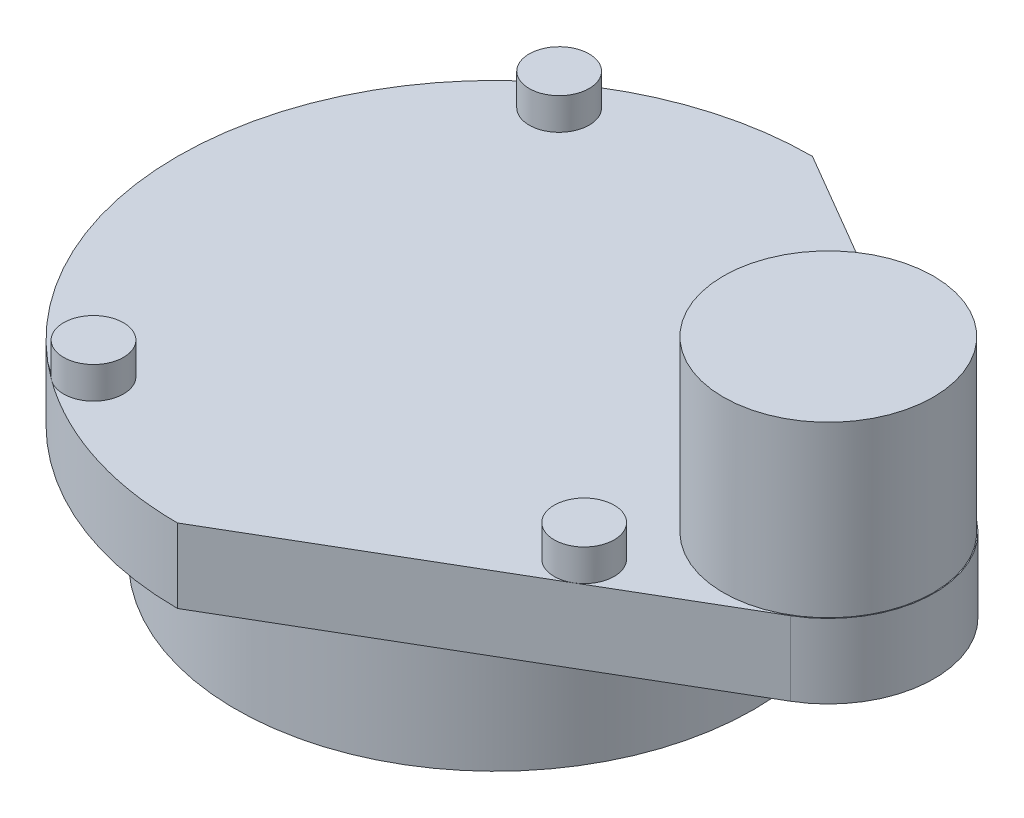
ISO-10303-21;
HEADER;
FILE_DESCRIPTION(('STEP AP214'),'2;1');
FILE_NAME('part.step','',(''),(''),'','','');
FILE_SCHEMA(('AUTOMOTIVE_DESIGN { 1 0 10303 214 1 1 1 1 }'));
ENDSEC;
DATA;
#1=APPLICATION_CONTEXT('core data for automotive mechanical design processes');
#2=APPLICATION_PROTOCOL_DEFINITION('international standard','automotive_design',2000,#1);
#3=PRODUCT_CONTEXT('',#1,'mechanical');
#4=PRODUCT('Part','Part','',(#3));
#5=PRODUCT_RELATED_PRODUCT_CATEGORY('part','',(#4));
#6=PRODUCT_DEFINITION_FORMATION('','',#4);
#7=PRODUCT_DEFINITION_CONTEXT('part definition',#1,'design');
#8=PRODUCT_DEFINITION('design','',#6,#7);
#9=PRODUCT_DEFINITION_SHAPE('','',#8);
#10=(LENGTH_UNIT() NAMED_UNIT(*) SI_UNIT(.MILLI.,.METRE.));
#11=(NAMED_UNIT(*) PLANE_ANGLE_UNIT() SI_UNIT($,.RADIAN.));
#12=(NAMED_UNIT(*) SI_UNIT($,.STERADIAN.) SOLID_ANGLE_UNIT());
#13=UNCERTAINTY_MEASURE_WITH_UNIT(LENGTH_MEASURE(1.E-05),#10,'distance_accuracy_value','');
#14=(GEOMETRIC_REPRESENTATION_CONTEXT(3) GLOBAL_UNCERTAINTY_ASSIGNED_CONTEXT((#13)) GLOBAL_UNIT_ASSIGNED_CONTEXT((#10,
#11,#12)) REPRESENTATION_CONTEXT('',''));
#15=CARTESIAN_POINT('',(0.,0.,0.));
#16=DIRECTION('',(0.,0.,1.));
#17=DIRECTION('',(1.,0.,0.));
#18=AXIS2_PLACEMENT_3D('',#15,#16,#17);
#19=CARTESIAN_POINT('',(0.,-4.7625,0.));
#20=DIRECTION('',(0.,-1.,0.));
#21=DIRECTION('',(1.,0.,0.));
#22=AXIS2_PLACEMENT_3D('',#19,#20,#21);
#23=PLANE('',#22);
#24=CARTESIAN_POINT('',(0.,-4.7625,0.));
#25=DIRECTION('',(0.,-1.,0.));
#26=DIRECTION('',(1.,0.,0.));
#27=AXIS2_PLACEMENT_3D('',#24,#25,#26);
#28=CIRCLE('',#27,47.625);
#29=CARTESIAN_POINT('',(-27.9382539410221,-4.76250000002943,-38.5693478260847));
#30=VERTEX_POINT('',#29);
#31=CARTESIAN_POINT('',(-1.70466679303106E-10,-4.7625,-47.625));
#32=VERTEX_POINT('',#31);
#33=EDGE_CURVE('E82',#30,#32,#28,.T.);
#34=ORIENTED_EDGE('',*,*,#33,.F.);
#35=CARTESIAN_POINT('',(-25.2984189229742,-4.76250000002665,-34.925));
#36=DIRECTION('',(0.,-1.,0.));
#37=DIRECTION('',(1.,0.,0.));
#38=AXIS2_PLACEMENT_3D('',#35,#36,#37);
#39=CIRCLE('',#38,4.5);
#40=EDGE_CURVE('E104',#30,#30,#39,.T.);
#41=ORIENTED_EDGE('',*,*,#40,.T.);
#42=CARTESIAN_POINT('',(-27.9382539410221,-4.76250000002943,38.5693478260847));
#43=VERTEX_POINT('',#42);
#44=EDGE_CURVE('E93',#43,#30,#28,.T.);
#45=ORIENTED_EDGE('',*,*,#44,.F.);
#46=CARTESIAN_POINT('',(-25.2984189229742,-4.76250000002665,34.925));
#47=DIRECTION('',(0.,-1.,0.));
#48=DIRECTION('',(1.,0.,0.));
#49=AXIS2_PLACEMENT_3D('',#46,#47,#48);
#50=CIRCLE('',#49,4.5);
#51=EDGE_CURVE('E219',#43,#43,#50,.T.);
#52=ORIENTED_EDGE('',*,*,#51,.T.);
#53=CARTESIAN_POINT('',(-5.67658206880522E-11,-4.7625,47.6250000000533));
#54=VERTEX_POINT('',#53);
#55=EDGE_CURVE('E97',#54,#43,#28,.T.);
#56=ORIENTED_EDGE('',*,*,#55,.F.);
#57=DIRECTION('',(0.86328533345341,0.,-0.504716190590549));
#58=VECTOR('',#57,1.);
#59=CARTESIAN_POINT('',(171089.791720872,-4.76250000119319,-99979.3123057166));
#60=LINE('',#59,#58);
#61=CARTESIAN_POINT('',(37.4792549511165,-4.76250000002666,25.7129090005403));
#62=VERTEX_POINT('',#61);
#63=EDGE_CURVE('E113',#54,#62,#60,.T.);
#64=ORIENTED_EDGE('',*,*,#63,.T.);
#65=CARTESIAN_POINT('',(35.2080320934591,-4.76250000002665,21.828125));
#66=DIRECTION('',(0.,-1.,0.));
#67=DIRECTION('',(1.,0.,0.));
#68=AXIS2_PLACEMENT_3D('',#65,#66,#67);
#69=CIRCLE('',#68,4.5);
#70=EDGE_CURVE('E224',#62,#62,#69,.T.);
#71=ORIENTED_EDGE('',*,*,#70,.T.);
#72=CARTESIAN_POINT('',(58.0186195255589,-4.76250000000041,13.7046546686115));
#73=VERTEX_POINT('',#72);
#74=EDGE_CURVE('E112',#62,#73,#60,.T.);
#75=ORIENTED_EDGE('',*,*,#74,.T.);
#76=CARTESIAN_POINT('',(50.00625,-4.76250000000035,0.));
#77=DIRECTION('',(0.,-1.,0.));
#78=DIRECTION('',(1.,0.,0.));
#79=AXIS2_PLACEMENT_3D('',#76,#77,#78);
#80=CIRCLE('',#79,15.875);
#81=CARTESIAN_POINT('',(58.0186195254494,-4.76250000000041,-13.7046546686755));
#82=VERTEX_POINT('',#81);
#83=EDGE_CURVE('E118',#82,#73,#80,.T.);
#84=ORIENTED_EDGE('',*,*,#83,.F.);
#85=DIRECTION('',(-0.86328533345341,0.,-0.504716190590549));
#86=VECTOR('',#85,1.);
#87=CARTESIAN_POINT('',(425160.963610326,-4.7625000029651,248520.969444668));
#88=LINE('',#87,#86);
#89=CARTESIAN_POINT('',(37.4792549511346,-4.76250000002666,-25.7129090005712));
#90=VERTEX_POINT('',#89);
#91=EDGE_CURVE('E108',#82,#90,#88,.T.);
#92=ORIENTED_EDGE('',*,*,#91,.T.);
#93=CARTESIAN_POINT('',(35.2080320934591,-4.76250000002665,-21.828125));
#94=DIRECTION('',(0.,-1.,0.));
#95=DIRECTION('',(1.,0.,0.));
#96=AXIS2_PLACEMENT_3D('',#93,#94,#95);
#97=CIRCLE('',#96,4.5);
#98=EDGE_CURVE('E48',#90,#90,#97,.T.);
#99=ORIENTED_EDGE('',*,*,#98,.T.);
#100=EDGE_CURVE('E106',#90,#32,#88,.T.);
#101=ORIENTED_EDGE('',*,*,#100,.T.);
#102=EDGE_LOOP('',(#34,#41,#45,#52,#56,#64,#71,#75,#84,#92,#99,#101));
#103=FACE_BOUND('',#102,.T.);
#104=CARTESIAN_POINT('',(50.00625,-4.76250000000035,0.));
#105=DIRECTION('',(0.,-1.,0.));
#106=DIRECTION('',(1.,0.,0.));
#107=AXIS2_PLACEMENT_3D('',#104,#105,#106);
#108=CIRCLE('',#107,15.748);
#109=CARTESIAN_POINT('',(65.75425,-4.76250000000046,0.));
#110=VERTEX_POINT('',#109);
#111=EDGE_CURVE('E11',#110,#110,#108,.F.);
#112=ORIENTED_EDGE('',*,*,#111,.F.);
#113=EDGE_LOOP('',(#112));
#114=FACE_BOUND('',#113,.T.);
#115=ADVANCED_FACE('F35',(#103,#114),#23,.F.);
#116=CARTESIAN_POINT('',(0.,-33.3375,0.));
#117=DIRECTION('',(0.,1.,0.));
#118=DIRECTION('',(0.,0.,1.));
#119=AXIS2_PLACEMENT_3D('',#116,#117,#118);
#120=CYLINDRICAL_SURFACE('',#119,38.89375);
#121=CARTESIAN_POINT('',(0.,-33.3375,0.));
#122=DIRECTION('',(0.,-1.,0.));
#123=DIRECTION('',(1.,0.,0.));
#124=AXIS2_PLACEMENT_3D('',#121,#122,#123);
#125=CIRCLE('',#124,38.89375);
#126=CARTESIAN_POINT('',(38.89375,-33.3375000000003,0.));
#127=VERTEX_POINT('',#126);
#128=EDGE_CURVE('E43',#127,#127,#125,.T.);
#129=ORIENTED_EDGE('',*,*,#128,.F.);
#130=EDGE_LOOP('',(#129));
#131=FACE_BOUND('',#130,.T.);
#132=CARTESIAN_POINT('',(0.,-15.875,0.));
#133=DIRECTION('',(0.,-1.,0.));
#134=DIRECTION('',(1.,0.,0.));
#135=AXIS2_PLACEMENT_3D('',#132,#133,#134);
#136=CIRCLE('',#135,38.89375);
#137=CARTESIAN_POINT('',(38.89375,-15.8750000000003,0.));
#138=VERTEX_POINT('',#137);
#139=EDGE_CURVE('E140',#138,#138,#136,.T.);
#140=ORIENTED_EDGE('',*,*,#139,.T.);
#141=EDGE_LOOP('',(#140));
#142=FACE_BOUND('',#141,.T.);
#143=ADVANCED_FACE('F37',(#131,#142),#120,.T.);
#144=CARTESIAN_POINT('',(0.,-33.3375,0.));
#145=DIRECTION('',(0.,-1.,0.));
#146=DIRECTION('',(1.,0.,0.));
#147=AXIS2_PLACEMENT_3D('',#144,#145,#146);
#148=PLANE('',#147);
#149=ORIENTED_EDGE('',*,*,#128,.T.);
#150=EDGE_LOOP('',(#149));
#151=FACE_BOUND('',#150,.T.);
#152=ADVANCED_FACE('F145',(#151),#148,.T.);
#153=CARTESIAN_POINT('',(-1.10854532508269E-13,-15.875,0.));
#154=DIRECTION('',(0.,-1.,0.));
#155=DIRECTION('',(1.,0.,0.));
#156=AXIS2_PLACEMENT_3D('',#153,#154,#155);
#157=PLANE('',#156);
#158=DIRECTION('',(-0.86328533345341,0.,-0.504716190590549));
#159=VECTOR('',#158,1.);
#160=CARTESIAN_POINT('',(425160.963610326,-15.8750000029651,248520.969444668));
#161=LINE('',#160,#159);
#162=CARTESIAN_POINT('',(58.0186195254493,-15.8750000000004,-13.7046546686755));
#163=VERTEX_POINT('',#162);
#164=CARTESIAN_POINT('',(-1.70544277475862E-10,-15.875,-47.625));
#165=VERTEX_POINT('',#164);
#166=EDGE_CURVE('E121',#163,#165,#161,.T.);
#167=ORIENTED_EDGE('',*,*,#166,.F.);
#168=CARTESIAN_POINT('',(50.0062499999999,-15.8750000000003,0.));
#169=DIRECTION('',(0.,-1.,0.));
#170=DIRECTION('',(1.,0.,0.));
#171=AXIS2_PLACEMENT_3D('',#168,#169,#170);
#172=CIRCLE('',#171,15.875);
#173=CARTESIAN_POINT('',(58.0186195255588,-15.8750000000004,13.7046546686115));
#174=VERTEX_POINT('',#173);
#175=EDGE_CURVE('E130',#163,#174,#172,.T.);
#176=ORIENTED_EDGE('',*,*,#175,.T.);
#177=DIRECTION('',(0.86328533345341,0.,-0.504716190590549));
#178=VECTOR('',#177,1.);
#179=CARTESIAN_POINT('',(171089.791720872,-15.8750000011932,-99979.3123057166));
#180=LINE('',#179,#178);
#181=CARTESIAN_POINT('',(-5.6843418860808E-11,-15.875,47.6250000000533));
#182=VERTEX_POINT('',#181);
#183=EDGE_CURVE('E127',#182,#174,#180,.T.);
#184=ORIENTED_EDGE('',*,*,#183,.F.);
#185=CARTESIAN_POINT('',(-1.10854532508269E-13,-15.875,0.));
#186=DIRECTION('',(0.,-1.,0.));
#187=DIRECTION('',(1.,0.,0.));
#188=AXIS2_PLACEMENT_3D('',#185,#186,#187);
#189=CIRCLE('',#188,47.625);
#190=EDGE_CURVE('E123',#182,#165,#189,.T.);
#191=ORIENTED_EDGE('',*,*,#190,.T.);
#192=EDGE_LOOP('',(#167,#176,#184,#191));
#193=FACE_BOUND('',#192,.T.);
#194=ORIENTED_EDGE('',*,*,#139,.F.);
#195=EDGE_LOOP('',(#194));
#196=FACE_BOUND('',#195,.T.);
#197=ADVANCED_FACE('F151',(#193,#196),#157,.T.);
#198=CARTESIAN_POINT('',(425160.963610326,-4.7625000029651,248520.969444668));
#199=DIRECTION('',(-0.504716190590549,0.,0.86328533345341));
#200=DIRECTION('',(0.86328533345341,0.,0.504716190590549));
#201=AXIS2_PLACEMENT_3D('',#198,#199,#200);
#202=PLANE('',#201);
#203=ORIENTED_EDGE('',*,*,#166,.T.);
#204=DIRECTION('',(0.,-1.,0.));
#205=VECTOR('',#204,1.);
#206=CARTESIAN_POINT('',(-1.70466679303106E-10,-4.7625,-47.625));
#207=LINE('',#206,#205);
#208=EDGE_CURVE('E138',#32,#165,#207,.T.);
#209=ORIENTED_EDGE('',*,*,#208,.F.);
#210=ORIENTED_EDGE('',*,*,#100,.F.);
#211=ORIENTED_EDGE('',*,*,#91,.F.);
#212=DIRECTION('',(0.,-1.,0.));
#213=VECTOR('',#212,1.);
#214=CARTESIAN_POINT('',(58.0186195254494,-4.76250000000041,-13.7046546686755));
#215=LINE('',#214,#213);
#216=EDGE_CURVE('E56',#82,#163,#215,.T.);
#217=ORIENTED_EDGE('',*,*,#216,.T.);
#218=EDGE_LOOP('',(#203,#209,#210,#211,#217));
#219=FACE_BOUND('',#218,.T.);
#220=ADVANCED_FACE('F153',(#219),#202,.F.);
#221=CARTESIAN_POINT('',(0.,-4.7625,0.));
#222=DIRECTION('',(0.,-1.,0.));
#223=DIRECTION('',(1.,0.,0.));
#224=AXIS2_PLACEMENT_3D('',#221,#222,#223);
#225=CYLINDRICAL_SURFACE('',#224,47.625);
#226=ORIENTED_EDGE('',*,*,#190,.F.);
#227=DIRECTION('',(0.,-1.,0.));
#228=VECTOR('',#227,1.);
#229=CARTESIAN_POINT('',(-5.67658206880522E-11,-4.7625,47.6250000000533));
#230=LINE('',#229,#228);
#231=EDGE_CURVE('E136',#54,#182,#230,.T.);
#232=ORIENTED_EDGE('',*,*,#231,.F.);
#233=ORIENTED_EDGE('',*,*,#55,.T.);
#234=ORIENTED_EDGE('',*,*,#44,.T.);
#235=ORIENTED_EDGE('',*,*,#33,.T.);
#236=ORIENTED_EDGE('',*,*,#208,.T.);
#237=EDGE_LOOP('',(#226,#232,#233,#234,#235,#236));
#238=FACE_BOUND('',#237,.T.);
#239=ADVANCED_FACE('F95',(#238),#225,.T.);
#240=CARTESIAN_POINT('',(171089.791720872,-4.76250000119319,-99979.3123057166));
#241=DIRECTION('',(-0.504716190590549,0.,-0.86328533345341));
#242=DIRECTION('',(-0.86328533345341,0.,0.504716190590549));
#243=AXIS2_PLACEMENT_3D('',#240,#241,#242);
#244=PLANE('',#243);
#245=ORIENTED_EDGE('',*,*,#183,.T.);
#246=DIRECTION('',(0.,-1.,0.));
#247=VECTOR('',#246,1.);
#248=CARTESIAN_POINT('',(58.0186195255589,-4.76250000000041,13.7046546686115));
#249=LINE('',#248,#247);
#250=EDGE_CURVE('E134',#73,#174,#249,.T.);
#251=ORIENTED_EDGE('',*,*,#250,.F.);
#252=ORIENTED_EDGE('',*,*,#74,.F.);
#253=ORIENTED_EDGE('',*,*,#63,.F.);
#254=ORIENTED_EDGE('',*,*,#231,.T.);
#255=EDGE_LOOP('',(#245,#251,#252,#253,#254));
#256=FACE_BOUND('',#255,.T.);
#257=ADVANCED_FACE('F235',(#256),#244,.F.);
#258=CARTESIAN_POINT('',(50.00625,-4.76250000000035,0.));
#259=DIRECTION('',(0.,-1.,0.));
#260=DIRECTION('',(1.,0.,0.));
#261=AXIS2_PLACEMENT_3D('',#258,#259,#260);
#262=CYLINDRICAL_SURFACE('',#261,15.875);
#263=ORIENTED_EDGE('',*,*,#175,.F.);
#264=ORIENTED_EDGE('',*,*,#216,.F.);
#265=ORIENTED_EDGE('',*,*,#83,.T.);
#266=ORIENTED_EDGE('',*,*,#250,.T.);
#267=EDGE_LOOP('',(#263,#264,#265,#266));
#268=FACE_BOUND('',#267,.T.);
#269=ADVANCED_FACE('F173',(#268),#262,.T.);
#270=CARTESIAN_POINT('',(35.2080320899676,-500000.,-21.828125));
#271=DIRECTION('',(0.,1.,0.));
#272=DIRECTION('',(-1.,0.,0.));
#273=AXIS2_PLACEMENT_3D('',#270,#271,#272);
#274=CYLINDRICAL_SURFACE('',#273,4.5);
#275=CARTESIAN_POINT('',(35.2080320934591,-2.45856374063405E-13,-21.828125));
#276=DIRECTION('',(0.,-1.,0.));
#277=DIRECTION('',(1.,0.,0.));
#278=AXIS2_PLACEMENT_3D('',#275,#276,#277);
#279=CIRCLE('',#278,4.5);
#280=CARTESIAN_POINT('',(39.7080320934591,-2.77279706112993E-13,-21.828125));
#281=VERTEX_POINT('',#280);
#282=EDGE_CURVE('E124',#281,#281,#279,.T.);
#283=ORIENTED_EDGE('',*,*,#282,.T.);
#284=EDGE_LOOP('',(#283));
#285=FACE_BOUND('',#284,.T.);
#286=ORIENTED_EDGE('',*,*,#98,.F.);
#287=EDGE_LOOP('',(#286));
#288=FACE_BOUND('',#287,.T.);
#289=ADVANCED_FACE('F169',(#285,#288),#274,.T.);
#290=CARTESIAN_POINT('',(35.2080320934591,-2.45856374063405E-13,-21.828125));
#291=DIRECTION('',(0.,-1.,0.));
#292=DIRECTION('',(1.,0.,0.));
#293=AXIS2_PLACEMENT_3D('',#290,#291,#292);
#294=PLANE('',#293);
#295=ORIENTED_EDGE('',*,*,#282,.F.);
#296=EDGE_LOOP('',(#295));
#297=FACE_BOUND('',#296,.T.);
#298=ADVANCED_FACE('F172',(#297),#294,.F.);
#299=CARTESIAN_POINT('',(35.2080320899676,-500000.,21.828125));
#300=DIRECTION('',(0.,1.,0.));
#301=DIRECTION('',(-1.,0.,0.));
#302=AXIS2_PLACEMENT_3D('',#299,#300,#301);
#303=CYLINDRICAL_SURFACE('',#302,4.5);
#304=CARTESIAN_POINT('',(35.2080320934591,-2.45856374063405E-13,21.828125));
#305=DIRECTION('',(0.,-1.,0.));
#306=DIRECTION('',(1.,0.,0.));
#307=AXIS2_PLACEMENT_3D('',#304,#305,#306);
#308=CIRCLE('',#307,4.5);
#309=CARTESIAN_POINT('',(39.7080320934591,-2.77279706112993E-13,21.828125));
#310=VERTEX_POINT('',#309);
#311=EDGE_CURVE('E226',#310,#310,#308,.T.);
#312=ORIENTED_EDGE('',*,*,#311,.T.);
#313=EDGE_LOOP('',(#312));
#314=FACE_BOUND('',#313,.T.);
#315=ORIENTED_EDGE('',*,*,#70,.F.);
#316=EDGE_LOOP('',(#315));
#317=FACE_BOUND('',#316,.T.);
#318=ADVANCED_FACE('F177',(#314,#317),#303,.T.);
#319=CARTESIAN_POINT('',(35.2080320934591,-2.45856374063405E-13,21.828125));
#320=DIRECTION('',(0.,-1.,0.));
#321=DIRECTION('',(1.,0.,0.));
#322=AXIS2_PLACEMENT_3D('',#319,#320,#321);
#323=PLANE('',#322);
#324=ORIENTED_EDGE('',*,*,#311,.F.);
#325=EDGE_LOOP('',(#324));
#326=FACE_BOUND('',#325,.T.);
#327=ADVANCED_FACE('F179',(#326),#323,.F.);
#328=CARTESIAN_POINT('',(-25.2984189264657,-500000.,34.925));
#329=DIRECTION('',(0.,1.,0.));
#330=DIRECTION('',(-1.,0.,0.));
#331=AXIS2_PLACEMENT_3D('',#328,#329,#330);
#332=CYLINDRICAL_SURFACE('',#331,4.5);
#333=CARTESIAN_POINT('',(-25.2984189229742,1.76657915143601E-13,34.925));
#334=DIRECTION('',(0.,-1.,0.));
#335=DIRECTION('',(1.,0.,0.));
#336=AXIS2_PLACEMENT_3D('',#333,#334,#335);
#337=CIRCLE('',#336,4.5);
#338=CARTESIAN_POINT('',(-20.7984189229742,1.45234583094013E-13,34.925));
#339=VERTEX_POINT('',#338);
#340=EDGE_CURVE('E221',#339,#339,#337,.T.);
#341=ORIENTED_EDGE('',*,*,#340,.T.);
#342=EDGE_LOOP('',(#341));
#343=FACE_BOUND('',#342,.T.);
#344=ORIENTED_EDGE('',*,*,#51,.F.);
#345=EDGE_LOOP('',(#344));
#346=FACE_BOUND('',#345,.T.);
#347=ADVANCED_FACE('F186',(#343,#346),#332,.T.);
#348=CARTESIAN_POINT('',(-25.2984189229742,1.76657915143601E-13,34.925));
#349=DIRECTION('',(0.,-1.,0.));
#350=DIRECTION('',(1.,0.,0.));
#351=AXIS2_PLACEMENT_3D('',#348,#349,#350);
#352=PLANE('',#351);
#353=ORIENTED_EDGE('',*,*,#340,.F.);
#354=EDGE_LOOP('',(#353));
#355=FACE_BOUND('',#354,.T.);
#356=ADVANCED_FACE('F183',(#355),#352,.F.);
#357=CARTESIAN_POINT('',(-25.2984189264657,-500000.,-34.925));
#358=DIRECTION('',(0.,1.,0.));
#359=DIRECTION('',(-1.,0.,0.));
#360=AXIS2_PLACEMENT_3D('',#357,#358,#359);
#361=CYLINDRICAL_SURFACE('',#360,4.5);
#362=CARTESIAN_POINT('',(-25.2984189229742,1.76657915143601E-13,-34.925));
#363=DIRECTION('',(0.,-1.,0.));
#364=DIRECTION('',(1.,0.,0.));
#365=AXIS2_PLACEMENT_3D('',#362,#363,#364);
#366=CIRCLE('',#365,4.5);
#367=CARTESIAN_POINT('',(-20.7984189229742,1.45234583094013E-13,-34.925));
#368=VERTEX_POINT('',#367);
#369=EDGE_CURVE('E215',#368,#368,#366,.T.);
#370=ORIENTED_EDGE('',*,*,#369,.T.);
#371=EDGE_LOOP('',(#370));
#372=FACE_BOUND('',#371,.T.);
#373=ORIENTED_EDGE('',*,*,#40,.F.);
#374=EDGE_LOOP('',(#373));
#375=FACE_BOUND('',#374,.T.);
#376=ADVANCED_FACE('F191',(#372,#375),#361,.T.);
#377=CARTESIAN_POINT('',(-25.2984189229742,1.76657915143601E-13,-34.925));
#378=DIRECTION('',(0.,-1.,0.));
#379=DIRECTION('',(1.,0.,0.));
#380=AXIS2_PLACEMENT_3D('',#377,#378,#379);
#381=PLANE('',#380);
#382=ORIENTED_EDGE('',*,*,#369,.F.);
#383=EDGE_LOOP('',(#382));
#384=FACE_BOUND('',#383,.T.);
#385=ADVANCED_FACE('F197',(#384),#381,.F.);
#386=CARTESIAN_POINT('',(50.0062500000001,20.6374999999996,0.));
#387=DIRECTION('',(0.,-1.,0.));
#388=DIRECTION('',(1.,0.,0.));
#389=AXIS2_PLACEMENT_3D('',#386,#387,#388);
#390=CYLINDRICAL_SURFACE('',#389,15.748);
#391=CARTESIAN_POINT('',(50.0062500000001,20.6374999999996,0.));
#392=DIRECTION('',(0.,1.,0.));
#393=DIRECTION('',(-1.,0.,0.));
#394=AXIS2_PLACEMENT_3D('',#391,#392,#393);
#395=CIRCLE('',#394,15.748);
#396=CARTESIAN_POINT('',(34.2582500000001,20.6374999999998,0.));
#397=VERTEX_POINT('',#396);
#398=EDGE_CURVE('E213',#397,#397,#395,.T.);
#399=ORIENTED_EDGE('',*,*,#398,.F.);
#400=EDGE_LOOP('',(#399));
#401=FACE_BOUND('',#400,.T.);
#402=ORIENTED_EDGE('',*,*,#111,.T.);
#403=EDGE_LOOP('',(#402));
#404=FACE_BOUND('',#403,.T.);
#405=ADVANCED_FACE('F201',(#401,#404),#390,.T.);
#406=CARTESIAN_POINT('',(50.0062500000001,20.6374999999996,0.));
#407=DIRECTION('',(0.,1.,0.));
#408=DIRECTION('',(-1.,0.,0.));
#409=AXIS2_PLACEMENT_3D('',#406,#407,#408);
#410=PLANE('',#409);
#411=ORIENTED_EDGE('',*,*,#398,.T.);
#412=EDGE_LOOP('',(#411));
#413=FACE_BOUND('',#412,.T.);
#414=ADVANCED_FACE('F205',(#413),#410,.T.);
#415=CLOSED_SHELL('',(#115,#143,#152,#197,#220,#239,#257,#269,#289,#298,#318,#327,#347,#356,
#376,#385,#405,#414));
#416=MANIFOLD_SOLID_BREP('B2',#415);
#417=ADVANCED_BREP_SHAPE_REPRESENTATION('',(#18,#416),#14);
#418=SHAPE_DEFINITION_REPRESENTATION(#9,#417);
ENDSEC;
END-ISO-10303-21;
